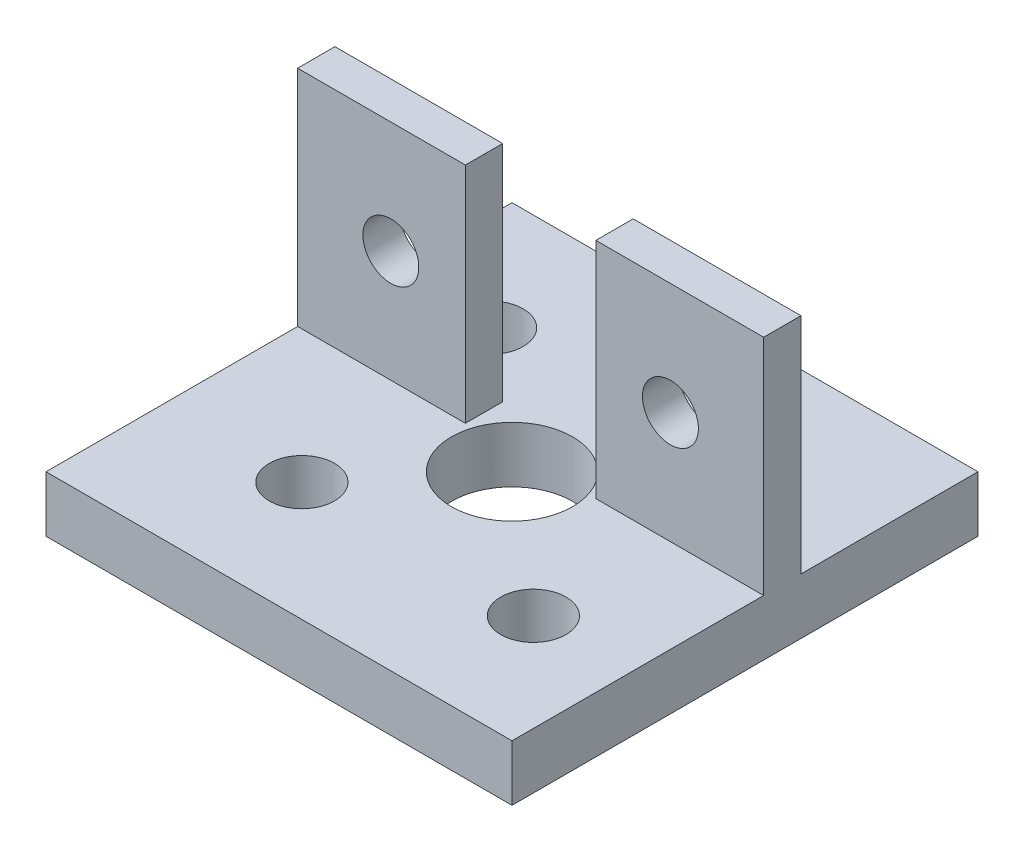
ISO-10303-21;
HEADER;
FILE_DESCRIPTION(('STEP AP214'),'2;1');
FILE_NAME('part.step','',(''),(''),'','','');
FILE_SCHEMA(('AUTOMOTIVE_DESIGN { 1 0 10303 214 1 1 1 1 }'));
ENDSEC;
DATA;
#1=APPLICATION_CONTEXT('core data for automotive mechanical design processes');
#2=APPLICATION_PROTOCOL_DEFINITION('international standard','automotive_design',2000,#1);
#3=PRODUCT_CONTEXT('',#1,'mechanical');
#4=PRODUCT('Part','Part','',(#3));
#5=PRODUCT_RELATED_PRODUCT_CATEGORY('part','',(#4));
#6=PRODUCT_DEFINITION_FORMATION('','',#4);
#7=PRODUCT_DEFINITION_CONTEXT('part definition',#1,'design');
#8=PRODUCT_DEFINITION('design','',#6,#7);
#9=PRODUCT_DEFINITION_SHAPE('','',#8);
#10=(LENGTH_UNIT() NAMED_UNIT(*) SI_UNIT(.MILLI.,.METRE.));
#11=(NAMED_UNIT(*) PLANE_ANGLE_UNIT() SI_UNIT($,.RADIAN.));
#12=(NAMED_UNIT(*) SI_UNIT($,.STERADIAN.) SOLID_ANGLE_UNIT());
#13=UNCERTAINTY_MEASURE_WITH_UNIT(LENGTH_MEASURE(1.E-05),#10,'distance_accuracy_value','');
#14=(GEOMETRIC_REPRESENTATION_CONTEXT(3) GLOBAL_UNCERTAINTY_ASSIGNED_CONTEXT((#13)) GLOBAL_UNIT_ASSIGNED_CONTEXT((#10,
#11,#12)) REPRESENTATION_CONTEXT('',''));
#15=CARTESIAN_POINT('',(0.,0.,0.));
#16=DIRECTION('',(0.,0.,1.));
#17=DIRECTION('',(1.,0.,0.));
#18=AXIS2_PLACEMENT_3D('',#15,#16,#17);
#19=CARTESIAN_POINT('',(0.,3.,0.));
#20=DIRECTION('',(0.,1.,0.));
#21=DIRECTION('',(0.,0.,1.));
#22=AXIS2_PLACEMENT_3D('',#19,#20,#21);
#23=PLANE('',#22);
#24=CARTESIAN_POINT('',(0.,3.,0.));
#25=DIRECTION('',(0.,1.,0.));
#26=DIRECTION('',(0.,0.,1.));
#27=AXIS2_PLACEMENT_3D('',#24,#25,#26);
#28=CIRCLE('',#27,3.25);
#29=CARTESIAN_POINT('',(0.,3.,3.25));
#30=VERTEX_POINT('',#29);
#31=EDGE_CURVE('E257',#30,#30,#28,.T.);
#32=ORIENTED_EDGE('',*,*,#31,.F.);
#33=EDGE_LOOP('',(#32));
#34=FACE_BOUND('',#33,.T.);
#35=CARTESIAN_POINT('',(5.15308596626224,3.,-6.11928958493641));
#36=DIRECTION('',(0.,1.,0.));
#37=DIRECTION('',(0.,0.,1.));
#38=AXIS2_PLACEMENT_3D('',#35,#36,#37);
#39=CIRCLE('',#38,1.75);
#40=CARTESIAN_POINT('',(5.15308596626224,3.,-4.36928958493641));
#41=VERTEX_POINT('',#40);
#42=EDGE_CURVE('E188',#41,#41,#39,.T.);
#43=ORIENTED_EDGE('',*,*,#42,.F.);
#44=EDGE_LOOP('',(#43));
#45=FACE_BOUND('',#44,.T.);
#46=CARTESIAN_POINT('',(-5.15308596626224,3.,6.11928958493641));
#47=DIRECTION('',(0.,1.,0.));
#48=DIRECTION('',(0.,0.,-1.));
#49=AXIS2_PLACEMENT_3D('',#46,#47,#48);
#50=CIRCLE('',#49,1.75);
#51=CARTESIAN_POINT('',(-5.15308596626224,3.,4.36928958493641));
#52=VERTEX_POINT('',#51);
#53=EDGE_CURVE('E195',#52,#52,#50,.T.);
#54=ORIENTED_EDGE('',*,*,#53,.F.);
#55=EDGE_LOOP('',(#54));
#56=FACE_BOUND('',#55,.T.);
#57=CARTESIAN_POINT('',(7.26665638211199,3.,6.11928958493641));
#58=DIRECTION('',(0.,1.,0.));
#59=DIRECTION('',(0.,0.,-1.));
#60=AXIS2_PLACEMENT_3D('',#57,#58,#59);
#61=CIRCLE('',#60,1.75);
#62=CARTESIAN_POINT('',(7.26665638211199,3.,4.3692895849364));
#63=VERTEX_POINT('',#62);
#64=EDGE_CURVE('E182',#63,#63,#61,.T.);
#65=ORIENTED_EDGE('',*,*,#64,.F.);
#66=EDGE_LOOP('',(#65));
#67=FACE_BOUND('',#66,.T.);
#68=CARTESIAN_POINT('',(-7.26665638211198,3.,-6.11928958493641));
#69=DIRECTION('',(0.,1.,0.));
#70=DIRECTION('',(0.,0.,1.));
#71=AXIS2_PLACEMENT_3D('',#68,#69,#70);
#72=CIRCLE('',#71,1.75);
#73=CARTESIAN_POINT('',(-7.26665638211198,3.,-4.36928958493641));
#74=VERTEX_POINT('',#73);
#75=EDGE_CURVE('E200',#74,#74,#72,.T.);
#76=ORIENTED_EDGE('',*,*,#75,.F.);
#77=EDGE_LOOP('',(#76));
#78=FACE_BOUND('',#77,.T.);
#79=DIRECTION('',(0.,0.,-1.));
#80=VECTOR('',#79,1.);
#81=CARTESIAN_POINT('',(12.5,3.,-12.5));
#82=LINE('',#81,#80);
#83=CARTESIAN_POINT('',(12.5,3.,12.5));
#84=VERTEX_POINT('',#83);
#85=CARTESIAN_POINT('',(12.5,3.,-0.999999999999999));
#86=VERTEX_POINT('',#85);
#87=EDGE_CURVE('E206',#84,#86,#82,.T.);
#88=ORIENTED_EDGE('',*,*,#87,.T.);
#89=DIRECTION('',(1.,0.,0.));
#90=VECTOR('',#89,1.);
#91=CARTESIAN_POINT('',(0.,3.,-1.));
#92=LINE('',#91,#90);
#93=CARTESIAN_POINT('',(3.5,3.,-1.));
#94=VERTEX_POINT('',#93);
#95=EDGE_CURVE('E53',#94,#86,#92,.T.);
#96=ORIENTED_EDGE('',*,*,#95,.F.);
#97=DIRECTION('',(0.,0.,1.));
#98=VECTOR('',#97,1.);
#99=CARTESIAN_POINT('',(3.5,3.,0.));
#100=LINE('',#99,#98);
#101=CARTESIAN_POINT('',(3.5,3.,-3.));
#102=VERTEX_POINT('',#101);
#103=EDGE_CURVE('E124',#102,#94,#100,.T.);
#104=ORIENTED_EDGE('',*,*,#103,.F.);
#105=DIRECTION('',(1.,0.,0.));
#106=VECTOR('',#105,1.);
#107=CARTESIAN_POINT('',(0.,3.,-3.));
#108=LINE('',#107,#106);
#109=CARTESIAN_POINT('',(12.5,3.,-3.));
#110=VERTEX_POINT('',#109);
#111=EDGE_CURVE('E59',#102,#110,#108,.T.);
#112=ORIENTED_EDGE('',*,*,#111,.T.);
#113=CARTESIAN_POINT('',(12.5,3.,-12.5));
#114=VERTEX_POINT('',#113);
#115=EDGE_CURVE('E209',#110,#114,#82,.T.);
#116=ORIENTED_EDGE('',*,*,#115,.T.);
#117=DIRECTION('',(-1.,0.,0.));
#118=VECTOR('',#117,1.);
#119=CARTESIAN_POINT('',(-12.5,3.,-12.5));
#120=LINE('',#119,#118);
#121=CARTESIAN_POINT('',(-12.5,3.,-12.5));
#122=VERTEX_POINT('',#121);
#123=EDGE_CURVE('E208',#114,#122,#120,.T.);
#124=ORIENTED_EDGE('',*,*,#123,.T.);
#125=DIRECTION('',(0.,0.,1.));
#126=VECTOR('',#125,1.);
#127=CARTESIAN_POINT('',(-12.5,3.,-12.5));
#128=LINE('',#127,#126);
#129=CARTESIAN_POINT('',(-12.5,3.,-3.));
#130=VERTEX_POINT('',#129);
#131=EDGE_CURVE('E212',#122,#130,#128,.T.);
#132=ORIENTED_EDGE('',*,*,#131,.T.);
#133=DIRECTION('',(1.,0.,0.));
#134=VECTOR('',#133,1.);
#135=CARTESIAN_POINT('',(0.,3.,-3.));
#136=LINE('',#135,#134);
#137=CARTESIAN_POINT('',(-3.5,3.,-3.));
#138=VERTEX_POINT('',#137);
#139=EDGE_CURVE('E168',#130,#138,#136,.T.);
#140=ORIENTED_EDGE('',*,*,#139,.T.);
#141=DIRECTION('',(0.,0.,1.));
#142=VECTOR('',#141,1.);
#143=CARTESIAN_POINT('',(-3.5,3.,0.));
#144=LINE('',#143,#142);
#145=CARTESIAN_POINT('',(-3.5,3.,-1.));
#146=VERTEX_POINT('',#145);
#147=EDGE_CURVE('E128',#138,#146,#144,.T.);
#148=ORIENTED_EDGE('',*,*,#147,.T.);
#149=DIRECTION('',(1.,0.,0.));
#150=VECTOR('',#149,1.);
#151=CARTESIAN_POINT('',(0.,3.,-1.));
#152=LINE('',#151,#150);
#153=CARTESIAN_POINT('',(-12.5,3.,-1.));
#154=VERTEX_POINT('',#153);
#155=EDGE_CURVE('E158',#154,#146,#152,.T.);
#156=ORIENTED_EDGE('',*,*,#155,.F.);
#157=CARTESIAN_POINT('',(-12.5,3.,12.5));
#158=VERTEX_POINT('',#157);
#159=EDGE_CURVE('E211',#154,#158,#128,.T.);
#160=ORIENTED_EDGE('',*,*,#159,.T.);
#161=DIRECTION('',(1.,0.,0.));
#162=VECTOR('',#161,1.);
#163=CARTESIAN_POINT('',(-12.5,3.,12.5));
#164=LINE('',#163,#162);
#165=EDGE_CURVE('E215',#158,#84,#164,.T.);
#166=ORIENTED_EDGE('',*,*,#165,.T.);
#167=EDGE_LOOP('',(#88,#96,#104,#112,#116,#124,#132,#140,#148,#156,#160,#166));
#168=FACE_BOUND('',#167,.T.);
#169=ADVANCED_FACE('F38',(#34,#45,#56,#67,#78,#168),#23,.T.);
#170=CARTESIAN_POINT('',(12.5,3.,-12.5));
#171=DIRECTION('',(-1.,0.,0.));
#172=DIRECTION('',(0.,0.,1.));
#173=AXIS2_PLACEMENT_3D('',#170,#171,#172);
#174=PLANE('',#173);
#175=DIRECTION('',(0.,0.,-1.));
#176=VECTOR('',#175,1.);
#177=CARTESIAN_POINT('',(12.5,0.,-12.5));
#178=LINE('',#177,#176);
#179=CARTESIAN_POINT('',(12.5,0.,12.5));
#180=VERTEX_POINT('',#179);
#181=CARTESIAN_POINT('',(12.5,0.,-12.5));
#182=VERTEX_POINT('',#181);
#183=EDGE_CURVE('E203',#180,#182,#178,.T.);
#184=ORIENTED_EDGE('',*,*,#183,.T.);
#185=DIRECTION('',(0.,-1.,0.));
#186=VECTOR('',#185,1.);
#187=CARTESIAN_POINT('',(12.5,3.,-12.5));
#188=LINE('',#187,#186);
#189=EDGE_CURVE('E11',#114,#182,#188,.T.);
#190=ORIENTED_EDGE('',*,*,#189,.F.);
#191=ORIENTED_EDGE('',*,*,#115,.F.);
#192=DIRECTION('',(0.,-1.,0.));
#193=VECTOR('',#192,1.);
#194=CARTESIAN_POINT('',(12.5,15.,-3.));
#195=LINE('',#194,#193);
#196=CARTESIAN_POINT('',(12.5,15.,-3.));
#197=VERTEX_POINT('',#196);
#198=EDGE_CURVE('E139',#197,#110,#195,.T.);
#199=ORIENTED_EDGE('',*,*,#198,.F.);
#200=DIRECTION('',(0.,0.,-1.));
#201=VECTOR('',#200,1.);
#202=CARTESIAN_POINT('',(12.5,15.,0.));
#203=LINE('',#202,#201);
#204=CARTESIAN_POINT('',(12.5,15.,-1.));
#205=VERTEX_POINT('',#204);
#206=EDGE_CURVE('E151',#205,#197,#203,.T.);
#207=ORIENTED_EDGE('',*,*,#206,.F.);
#208=DIRECTION('',(0.,-1.,0.));
#209=VECTOR('',#208,1.);
#210=CARTESIAN_POINT('',(12.5,15.,-1.));
#211=LINE('',#210,#209);
#212=EDGE_CURVE('E253',#205,#86,#211,.T.);
#213=ORIENTED_EDGE('',*,*,#212,.T.);
#214=ORIENTED_EDGE('',*,*,#87,.F.);
#215=DIRECTION('',(0.,-1.,0.));
#216=VECTOR('',#215,1.);
#217=CARTESIAN_POINT('',(12.5,3.,12.5));
#218=LINE('',#217,#216);
#219=EDGE_CURVE('E217',#84,#180,#218,.T.);
#220=ORIENTED_EDGE('',*,*,#219,.T.);
#221=EDGE_LOOP('',(#184,#190,#191,#199,#207,#213,#214,#220));
#222=FACE_BOUND('',#221,.T.);
#223=ADVANCED_FACE('F40',(#222),#174,.F.);
#224=CARTESIAN_POINT('',(-12.5,3.,-12.5));
#225=DIRECTION('',(0.,0.,1.));
#226=DIRECTION('',(1.,0.,0.));
#227=AXIS2_PLACEMENT_3D('',#224,#225,#226);
#228=PLANE('',#227);
#229=DIRECTION('',(-1.,0.,0.));
#230=VECTOR('',#229,1.);
#231=CARTESIAN_POINT('',(-12.5,0.,-12.5));
#232=LINE('',#231,#230);
#233=CARTESIAN_POINT('',(-12.5,0.,-12.5));
#234=VERTEX_POINT('',#233);
#235=EDGE_CURVE('E220',#182,#234,#232,.T.);
#236=ORIENTED_EDGE('',*,*,#235,.T.);
#237=DIRECTION('',(0.,-1.,0.));
#238=VECTOR('',#237,1.);
#239=CARTESIAN_POINT('',(-12.5,3.,-12.5));
#240=LINE('',#239,#238);
#241=EDGE_CURVE('E46',#122,#234,#240,.T.);
#242=ORIENTED_EDGE('',*,*,#241,.F.);
#243=ORIENTED_EDGE('',*,*,#123,.F.);
#244=ORIENTED_EDGE('',*,*,#189,.T.);
#245=EDGE_LOOP('',(#236,#242,#243,#244));
#246=FACE_BOUND('',#245,.T.);
#247=ADVANCED_FACE('F299',(#246),#228,.F.);
#248=CARTESIAN_POINT('',(-12.5,3.,-12.5));
#249=DIRECTION('',(1.,0.,0.));
#250=DIRECTION('',(0.,0.,-1.));
#251=AXIS2_PLACEMENT_3D('',#248,#249,#250);
#252=PLANE('',#251);
#253=DIRECTION('',(0.,0.,1.));
#254=VECTOR('',#253,1.);
#255=CARTESIAN_POINT('',(-12.5,0.,-12.5));
#256=LINE('',#255,#254);
#257=CARTESIAN_POINT('',(-12.5,0.,12.5));
#258=VERTEX_POINT('',#257);
#259=EDGE_CURVE('E222',#234,#258,#256,.T.);
#260=ORIENTED_EDGE('',*,*,#259,.T.);
#261=DIRECTION('',(0.,-1.,0.));
#262=VECTOR('',#261,1.);
#263=CARTESIAN_POINT('',(-12.5,3.,12.5));
#264=LINE('',#263,#262);
#265=EDGE_CURVE('E228',#158,#258,#264,.T.);
#266=ORIENTED_EDGE('',*,*,#265,.F.);
#267=ORIENTED_EDGE('',*,*,#159,.F.);
#268=DIRECTION('',(0.,-1.,0.));
#269=VECTOR('',#268,1.);
#270=CARTESIAN_POINT('',(-12.5,15.,-1.));
#271=LINE('',#270,#269);
#272=CARTESIAN_POINT('',(-12.5,15.,-1.));
#273=VERTEX_POINT('',#272);
#274=EDGE_CURVE('E174',#273,#154,#271,.T.);
#275=ORIENTED_EDGE('',*,*,#274,.F.);
#276=DIRECTION('',(0.,0.,1.));
#277=VECTOR('',#276,1.);
#278=CARTESIAN_POINT('',(-12.5,15.,0.));
#279=LINE('',#278,#277);
#280=CARTESIAN_POINT('',(-12.5,15.,-3.));
#281=VERTEX_POINT('',#280);
#282=EDGE_CURVE('E161',#281,#273,#279,.T.);
#283=ORIENTED_EDGE('',*,*,#282,.F.);
#284=DIRECTION('',(0.,-1.,0.));
#285=VECTOR('',#284,1.);
#286=CARTESIAN_POINT('',(-12.5,15.,-3.));
#287=LINE('',#286,#285);
#288=EDGE_CURVE('E176',#281,#130,#287,.T.);
#289=ORIENTED_EDGE('',*,*,#288,.T.);
#290=ORIENTED_EDGE('',*,*,#131,.F.);
#291=ORIENTED_EDGE('',*,*,#241,.T.);
#292=EDGE_LOOP('',(#260,#266,#267,#275,#283,#289,#290,#291));
#293=FACE_BOUND('',#292,.T.);
#294=ADVANCED_FACE('F235',(#293),#252,.F.);
#295=CARTESIAN_POINT('',(-12.5,3.,12.5));
#296=DIRECTION('',(0.,0.,-1.));
#297=DIRECTION('',(-1.,0.,0.));
#298=AXIS2_PLACEMENT_3D('',#295,#296,#297);
#299=PLANE('',#298);
#300=DIRECTION('',(1.,0.,0.));
#301=VECTOR('',#300,1.);
#302=CARTESIAN_POINT('',(-12.5,0.,12.5));
#303=LINE('',#302,#301);
#304=EDGE_CURVE('E224',#258,#180,#303,.T.);
#305=ORIENTED_EDGE('',*,*,#304,.T.);
#306=ORIENTED_EDGE('',*,*,#219,.F.);
#307=ORIENTED_EDGE('',*,*,#165,.F.);
#308=ORIENTED_EDGE('',*,*,#265,.T.);
#309=EDGE_LOOP('',(#305,#306,#307,#308));
#310=FACE_BOUND('',#309,.T.);
#311=ADVANCED_FACE('F245',(#310),#299,.F.);
#312=CARTESIAN_POINT('',(0.,0.,0.));
#313=DIRECTION('',(0.,1.,0.));
#314=DIRECTION('',(0.,0.,1.));
#315=AXIS2_PLACEMENT_3D('',#312,#313,#314);
#316=PLANE('',#315);
#317=CARTESIAN_POINT('',(0.,0.,0.));
#318=DIRECTION('',(0.,-1.,0.));
#319=DIRECTION('',(0.,0.,-1.));
#320=AXIS2_PLACEMENT_3D('',#317,#318,#319);
#321=CIRCLE('',#320,3.25);
#322=CARTESIAN_POINT('',(0.,0.,-3.25));
#323=VERTEX_POINT('',#322);
#324=EDGE_CURVE('E261',#323,#323,#321,.T.);
#325=ORIENTED_EDGE('',*,*,#324,.F.);
#326=EDGE_LOOP('',(#325));
#327=FACE_BOUND('',#326,.T.);
#328=CARTESIAN_POINT('',(5.15308596626224,0.,-6.11928958493641));
#329=DIRECTION('',(0.,1.,0.));
#330=DIRECTION('',(0.,0.,1.));
#331=AXIS2_PLACEMENT_3D('',#328,#329,#330);
#332=CIRCLE('',#331,1.75);
#333=CARTESIAN_POINT('',(5.15308596626224,0.,-4.36928958493641));
#334=VERTEX_POINT('',#333);
#335=EDGE_CURVE('E192',#334,#334,#332,.T.);
#336=ORIENTED_EDGE('',*,*,#335,.T.);
#337=EDGE_LOOP('',(#336));
#338=FACE_BOUND('',#337,.T.);
#339=CARTESIAN_POINT('',(-5.15308596626224,0.,6.11928958493641));
#340=DIRECTION('',(0.,1.,0.));
#341=DIRECTION('',(0.,0.,-1.));
#342=AXIS2_PLACEMENT_3D('',#339,#340,#341);
#343=CIRCLE('',#342,1.75);
#344=CARTESIAN_POINT('',(-5.15308596626224,0.,4.36928958493641));
#345=VERTEX_POINT('',#344);
#346=EDGE_CURVE('E185',#345,#345,#343,.T.);
#347=ORIENTED_EDGE('',*,*,#346,.T.);
#348=EDGE_LOOP('',(#347));
#349=FACE_BOUND('',#348,.T.);
#350=CARTESIAN_POINT('',(7.26665638211199,0.,6.11928958493641));
#351=DIRECTION('',(0.,1.,0.));
#352=DIRECTION('',(0.,0.,-1.));
#353=AXIS2_PLACEMENT_3D('',#350,#351,#352);
#354=CIRCLE('',#353,1.75);
#355=CARTESIAN_POINT('',(7.26665638211199,0.,4.3692895849364));
#356=VERTEX_POINT('',#355);
#357=EDGE_CURVE('E181',#356,#356,#354,.T.);
#358=ORIENTED_EDGE('',*,*,#357,.T.);
#359=EDGE_LOOP('',(#358));
#360=FACE_BOUND('',#359,.T.);
#361=CARTESIAN_POINT('',(-7.26665638211198,0.,-6.11928958493641));
#362=DIRECTION('',(0.,1.,0.));
#363=DIRECTION('',(0.,0.,1.));
#364=AXIS2_PLACEMENT_3D('',#361,#362,#363);
#365=CIRCLE('',#364,1.75);
#366=CARTESIAN_POINT('',(-7.26665638211198,0.,-4.36928958493641));
#367=VERTEX_POINT('',#366);
#368=EDGE_CURVE('E191',#367,#367,#365,.T.);
#369=ORIENTED_EDGE('',*,*,#368,.T.);
#370=EDGE_LOOP('',(#369));
#371=FACE_BOUND('',#370,.T.);
#372=ORIENTED_EDGE('',*,*,#183,.F.);
#373=ORIENTED_EDGE('',*,*,#304,.F.);
#374=ORIENTED_EDGE('',*,*,#259,.F.);
#375=ORIENTED_EDGE('',*,*,#235,.F.);
#376=EDGE_LOOP('',(#372,#373,#374,#375));
#377=FACE_BOUND('',#376,.T.);
#378=ADVANCED_FACE('F242',(#327,#338,#349,#360,#371,#377),#316,.F.);
#379=CARTESIAN_POINT('',(-7.26665638211198,3.,-6.11928958493641));
#380=DIRECTION('',(0.,-1.,0.));
#381=DIRECTION('',(0.,0.,-1.));
#382=AXIS2_PLACEMENT_3D('',#379,#380,#381);
#383=CYLINDRICAL_SURFACE('',#382,1.75);
#384=ORIENTED_EDGE('',*,*,#75,.T.);
#385=EDGE_LOOP('',(#384));
#386=FACE_BOUND('',#385,.T.);
#387=ORIENTED_EDGE('',*,*,#368,.F.);
#388=EDGE_LOOP('',(#387));
#389=FACE_BOUND('',#388,.T.);
#390=ADVANCED_FACE('F304',(#386,#389),#383,.F.);
#391=CARTESIAN_POINT('',(7.26665638211199,3.,6.11928958493641));
#392=DIRECTION('',(0.,-1.,0.));
#393=DIRECTION('',(0.,0.,-1.));
#394=AXIS2_PLACEMENT_3D('',#391,#392,#393);
#395=CYLINDRICAL_SURFACE('',#394,1.75);
#396=ORIENTED_EDGE('',*,*,#64,.T.);
#397=EDGE_LOOP('',(#396));
#398=FACE_BOUND('',#397,.T.);
#399=ORIENTED_EDGE('',*,*,#357,.F.);
#400=EDGE_LOOP('',(#399));
#401=FACE_BOUND('',#400,.T.);
#402=ADVANCED_FACE('F346',(#398,#401),#395,.F.);
#403=CARTESIAN_POINT('',(-5.15308596626224,3.,6.11928958493641));
#404=DIRECTION('',(0.,-1.,0.));
#405=DIRECTION('',(0.,0.,-1.));
#406=AXIS2_PLACEMENT_3D('',#403,#404,#405);
#407=CYLINDRICAL_SURFACE('',#406,1.75);
#408=ORIENTED_EDGE('',*,*,#53,.T.);
#409=EDGE_LOOP('',(#408));
#410=FACE_BOUND('',#409,.T.);
#411=ORIENTED_EDGE('',*,*,#346,.F.);
#412=EDGE_LOOP('',(#411));
#413=FACE_BOUND('',#412,.T.);
#414=ADVANCED_FACE('F349',(#410,#413),#407,.F.);
#415=CARTESIAN_POINT('',(5.15308596626224,3.,-6.11928958493641));
#416=DIRECTION('',(0.,-1.,0.));
#417=DIRECTION('',(0.,0.,-1.));
#418=AXIS2_PLACEMENT_3D('',#415,#416,#417);
#419=CYLINDRICAL_SURFACE('',#418,1.75);
#420=ORIENTED_EDGE('',*,*,#42,.T.);
#421=EDGE_LOOP('',(#420));
#422=FACE_BOUND('',#421,.T.);
#423=ORIENTED_EDGE('',*,*,#335,.F.);
#424=EDGE_LOOP('',(#423));
#425=FACE_BOUND('',#424,.T.);
#426=ADVANCED_FACE('F345',(#422,#425),#419,.F.);
#427=CARTESIAN_POINT('',(-3.5,15.,0.));
#428=DIRECTION('',(1.,0.,0.));
#429=DIRECTION('',(0.,0.,-1.));
#430=AXIS2_PLACEMENT_3D('',#427,#428,#429);
#431=PLANE('',#430);
#432=ORIENTED_EDGE('',*,*,#147,.F.);
#433=DIRECTION('',(0.,-1.,0.));
#434=VECTOR('',#433,1.);
#435=CARTESIAN_POINT('',(-3.5,15.,-3.));
#436=LINE('',#435,#434);
#437=CARTESIAN_POINT('',(-3.5,15.,-3.));
#438=VERTEX_POINT('',#437);
#439=EDGE_CURVE('E178',#438,#138,#436,.T.);
#440=ORIENTED_EDGE('',*,*,#439,.F.);
#441=DIRECTION('',(0.,0.,1.));
#442=VECTOR('',#441,1.);
#443=CARTESIAN_POINT('',(-3.5,15.,0.));
#444=LINE('',#443,#442);
#445=CARTESIAN_POINT('',(-3.5,15.,-1.));
#446=VERTEX_POINT('',#445);
#447=EDGE_CURVE('E154',#438,#446,#444,.T.);
#448=ORIENTED_EDGE('',*,*,#447,.T.);
#449=DIRECTION('',(0.,-1.,0.));
#450=VECTOR('',#449,1.);
#451=CARTESIAN_POINT('',(-3.5,15.,-1.));
#452=LINE('',#451,#450);
#453=EDGE_CURVE('E165',#446,#146,#452,.T.);
#454=ORIENTED_EDGE('',*,*,#453,.T.);
#455=EDGE_LOOP('',(#432,#440,#448,#454));
#456=FACE_BOUND('',#455,.T.);
#457=ADVANCED_FACE('F323',(#456),#431,.T.);
#458=CARTESIAN_POINT('',(0.,15.,-3.));
#459=DIRECTION('',(0.,0.,-1.));
#460=DIRECTION('',(-1.,0.,0.));
#461=AXIS2_PLACEMENT_3D('',#458,#459,#460);
#462=PLANE('',#461);
#463=CARTESIAN_POINT('',(-7.5,9.,-3.));
#464=DIRECTION('',(0.,0.,1.));
#465=DIRECTION('',(1.,0.,0.));
#466=AXIS2_PLACEMENT_3D('',#463,#464,#465);
#467=CIRCLE('',#466,1.5);
#468=CARTESIAN_POINT('',(-6.,9.,-3.));
#469=VERTEX_POINT('',#468);
#470=EDGE_CURVE('E267',#469,#469,#467,.T.);
#471=ORIENTED_EDGE('',*,*,#470,.T.);
#472=EDGE_LOOP('',(#471));
#473=FACE_BOUND('',#472,.T.);
#474=ORIENTED_EDGE('',*,*,#139,.F.);
#475=ORIENTED_EDGE('',*,*,#288,.F.);
#476=DIRECTION('',(1.,0.,0.));
#477=VECTOR('',#476,1.);
#478=CARTESIAN_POINT('',(0.,15.,-3.));
#479=LINE('',#478,#477);
#480=EDGE_CURVE('E157',#281,#438,#479,.T.);
#481=ORIENTED_EDGE('',*,*,#480,.T.);
#482=ORIENTED_EDGE('',*,*,#439,.T.);
#483=EDGE_LOOP('',(#474,#475,#481,#482));
#484=FACE_BOUND('',#483,.T.);
#485=ADVANCED_FACE('F318',(#473,#484),#462,.T.);
#486=CARTESIAN_POINT('',(0.,15.,-1.));
#487=DIRECTION('',(0.,0.,-1.));
#488=DIRECTION('',(-1.,0.,0.));
#489=AXIS2_PLACEMENT_3D('',#486,#487,#488);
#490=PLANE('',#489);
#491=CARTESIAN_POINT('',(-7.5,9.,-1.));
#492=DIRECTION('',(0.,0.,-1.));
#493=DIRECTION('',(-1.,0.,0.));
#494=AXIS2_PLACEMENT_3D('',#491,#492,#493);
#495=CIRCLE('',#494,1.5);
#496=CARTESIAN_POINT('',(-9.,9.,-1.));
#497=VERTEX_POINT('',#496);
#498=EDGE_CURVE('E271',#497,#497,#495,.T.);
#499=ORIENTED_EDGE('',*,*,#498,.T.);
#500=EDGE_LOOP('',(#499));
#501=FACE_BOUND('',#500,.T.);
#502=ORIENTED_EDGE('',*,*,#155,.T.);
#503=ORIENTED_EDGE('',*,*,#453,.F.);
#504=DIRECTION('',(1.,0.,0.));
#505=VECTOR('',#504,1.);
#506=CARTESIAN_POINT('',(0.,15.,-1.));
#507=LINE('',#506,#505);
#508=EDGE_CURVE('E163',#273,#446,#507,.T.);
#509=ORIENTED_EDGE('',*,*,#508,.F.);
#510=ORIENTED_EDGE('',*,*,#274,.T.);
#511=EDGE_LOOP('',(#502,#503,#509,#510));
#512=FACE_BOUND('',#511,.T.);
#513=ADVANCED_FACE('F330',(#501,#512),#490,.F.);
#514=CARTESIAN_POINT('',(0.,15.,0.));
#515=DIRECTION('',(0.,1.,0.));
#516=DIRECTION('',(0.,0.,1.));
#517=AXIS2_PLACEMENT_3D('',#514,#515,#516);
#518=PLANE('',#517);
#519=ORIENTED_EDGE('',*,*,#447,.F.);
#520=ORIENTED_EDGE('',*,*,#480,.F.);
#521=ORIENTED_EDGE('',*,*,#282,.T.);
#522=ORIENTED_EDGE('',*,*,#508,.T.);
#523=EDGE_LOOP('',(#519,#520,#521,#522));
#524=FACE_BOUND('',#523,.T.);
#525=ADVANCED_FACE('F325',(#524),#518,.T.);
#526=CARTESIAN_POINT('',(3.5,15.,0.));
#527=DIRECTION('',(1.,0.,0.));
#528=DIRECTION('',(0.,0.,-1.));
#529=AXIS2_PLACEMENT_3D('',#526,#527,#528);
#530=PLANE('',#529);
#531=ORIENTED_EDGE('',*,*,#103,.T.);
#532=DIRECTION('',(0.,-1.,0.));
#533=VECTOR('',#532,1.);
#534=CARTESIAN_POINT('',(3.5,15.,-1.));
#535=LINE('',#534,#533);
#536=CARTESIAN_POINT('',(3.5,15.,-1.));
#537=VERTEX_POINT('',#536);
#538=EDGE_CURVE('E256',#537,#94,#535,.T.);
#539=ORIENTED_EDGE('',*,*,#538,.F.);
#540=DIRECTION('',(0.,0.,1.));
#541=VECTOR('',#540,1.);
#542=CARTESIAN_POINT('',(3.5,15.,0.));
#543=LINE('',#542,#541);
#544=CARTESIAN_POINT('',(3.5,15.,-3.));
#545=VERTEX_POINT('',#544);
#546=EDGE_CURVE('E134',#545,#537,#543,.T.);
#547=ORIENTED_EDGE('',*,*,#546,.F.);
#548=DIRECTION('',(0.,-1.,0.));
#549=VECTOR('',#548,1.);
#550=CARTESIAN_POINT('',(3.5,15.,-3.));
#551=LINE('',#550,#549);
#552=EDGE_CURVE('E131',#545,#102,#551,.T.);
#553=ORIENTED_EDGE('',*,*,#552,.T.);
#554=EDGE_LOOP('',(#531,#539,#547,#553));
#555=FACE_BOUND('',#554,.T.);
#556=ADVANCED_FACE('F132',(#555),#530,.F.);
#557=CARTESIAN_POINT('',(0.,15.,-1.));
#558=DIRECTION('',(0.,0.,-1.));
#559=DIRECTION('',(-1.,0.,0.));
#560=AXIS2_PLACEMENT_3D('',#557,#558,#559);
#561=PLANE('',#560);
#562=CARTESIAN_POINT('',(7.5,9.,-1.));
#563=DIRECTION('',(0.,0.,-1.));
#564=DIRECTION('',(-1.,0.,0.));
#565=AXIS2_PLACEMENT_3D('',#562,#563,#564);
#566=CIRCLE('',#565,1.5);
#567=CARTESIAN_POINT('',(6.,9.,-1.));
#568=VERTEX_POINT('',#567);
#569=EDGE_CURVE('E266',#568,#568,#566,.F.);
#570=ORIENTED_EDGE('',*,*,#569,.F.);
#571=EDGE_LOOP('',(#570));
#572=FACE_BOUND('',#571,.T.);
#573=ORIENTED_EDGE('',*,*,#95,.T.);
#574=ORIENTED_EDGE('',*,*,#212,.F.);
#575=DIRECTION('',(1.,0.,0.));
#576=VECTOR('',#575,1.);
#577=CARTESIAN_POINT('',(0.,15.,-1.));
#578=LINE('',#577,#576);
#579=EDGE_CURVE('E146',#537,#205,#578,.T.);
#580=ORIENTED_EDGE('',*,*,#579,.F.);
#581=ORIENTED_EDGE('',*,*,#538,.T.);
#582=EDGE_LOOP('',(#573,#574,#580,#581));
#583=FACE_BOUND('',#582,.T.);
#584=ADVANCED_FACE('F255',(#572,#583),#561,.F.);
#585=CARTESIAN_POINT('',(0.,15.,-3.));
#586=DIRECTION('',(0.,0.,-1.));
#587=DIRECTION('',(-1.,0.,0.));
#588=AXIS2_PLACEMENT_3D('',#585,#586,#587);
#589=PLANE('',#588);
#590=CARTESIAN_POINT('',(7.5,9.,-3.));
#591=DIRECTION('',(0.,0.,-1.));
#592=DIRECTION('',(-1.,0.,0.));
#593=AXIS2_PLACEMENT_3D('',#590,#591,#592);
#594=CIRCLE('',#593,1.5);
#595=CARTESIAN_POINT('',(6.,9.,-3.));
#596=VERTEX_POINT('',#595);
#597=EDGE_CURVE('E270',#596,#596,#594,.T.);
#598=ORIENTED_EDGE('',*,*,#597,.F.);
#599=EDGE_LOOP('',(#598));
#600=FACE_BOUND('',#599,.T.);
#601=ORIENTED_EDGE('',*,*,#111,.F.);
#602=ORIENTED_EDGE('',*,*,#552,.F.);
#603=DIRECTION('',(1.,0.,0.));
#604=VECTOR('',#603,1.);
#605=CARTESIAN_POINT('',(0.,15.,-3.));
#606=LINE('',#605,#604);
#607=EDGE_CURVE('E138',#545,#197,#606,.T.);
#608=ORIENTED_EDGE('',*,*,#607,.T.);
#609=ORIENTED_EDGE('',*,*,#198,.T.);
#610=EDGE_LOOP('',(#601,#602,#608,#609));
#611=FACE_BOUND('',#610,.T.);
#612=ADVANCED_FACE('F142',(#600,#611),#589,.T.);
#613=CARTESIAN_POINT('',(0.,15.,0.));
#614=DIRECTION('',(0.,1.,0.));
#615=DIRECTION('',(0.,0.,1.));
#616=AXIS2_PLACEMENT_3D('',#613,#614,#615);
#617=PLANE('',#616);
#618=ORIENTED_EDGE('',*,*,#546,.T.);
#619=ORIENTED_EDGE('',*,*,#579,.T.);
#620=ORIENTED_EDGE('',*,*,#206,.T.);
#621=ORIENTED_EDGE('',*,*,#607,.F.);
#622=EDGE_LOOP('',(#618,#619,#620,#621));
#623=FACE_BOUND('',#622,.T.);
#624=ADVANCED_FACE('F282',(#623),#617,.T.);
#625=CARTESIAN_POINT('',(0.,15.,0.));
#626=DIRECTION('',(0.,-1.,0.));
#627=DIRECTION('',(0.,0.,-1.));
#628=AXIS2_PLACEMENT_3D('',#625,#626,#627);
#629=CYLINDRICAL_SURFACE('',#628,3.25);
#630=ORIENTED_EDGE('',*,*,#31,.T.);
#631=EDGE_LOOP('',(#630));
#632=FACE_BOUND('',#631,.T.);
#633=ORIENTED_EDGE('',*,*,#324,.T.);
#634=EDGE_LOOP('',(#633));
#635=FACE_BOUND('',#634,.T.);
#636=ADVANCED_FACE('F288',(#632,#635),#629,.F.);
#637=CARTESIAN_POINT('',(7.5,9.,3.24264068711929));
#638=DIRECTION('',(0.,0.,-1.));
#639=DIRECTION('',(-1.,0.,0.));
#640=AXIS2_PLACEMENT_3D('',#637,#638,#639);
#641=CYLINDRICAL_SURFACE('',#640,1.5);
#642=ORIENTED_EDGE('',*,*,#569,.T.);
#643=EDGE_LOOP('',(#642));
#644=FACE_BOUND('',#643,.T.);
#645=ORIENTED_EDGE('',*,*,#597,.T.);
#646=EDGE_LOOP('',(#645));
#647=FACE_BOUND('',#646,.T.);
#648=ADVANCED_FACE('F279',(#644,#647),#641,.F.);
#649=CARTESIAN_POINT('',(-7.5,9.,3.24264068711929));
#650=DIRECTION('',(0.,0.,-1.));
#651=DIRECTION('',(-1.,0.,0.));
#652=AXIS2_PLACEMENT_3D('',#649,#650,#651);
#653=CYLINDRICAL_SURFACE('',#652,1.5);
#654=ORIENTED_EDGE('',*,*,#498,.F.);
#655=EDGE_LOOP('',(#654));
#656=FACE_BOUND('',#655,.T.);
#657=ORIENTED_EDGE('',*,*,#470,.F.);
#658=EDGE_LOOP('',(#657));
#659=FACE_BOUND('',#658,.T.);
#660=ADVANCED_FACE('F476',(#656,#659),#653,.F.);
#661=CLOSED_SHELL('',(#169,#223,#247,#294,#311,#378,#390,#402,#414,#426,#457,#485,#513,#525,
#556,#584,#612,#624,#636,#648,#660));
#662=MANIFOLD_SOLID_BREP('B2',#661);
#663=ADVANCED_BREP_SHAPE_REPRESENTATION('',(#18,#662),#14);
#664=SHAPE_DEFINITION_REPRESENTATION(#9,#663);
ENDSEC;
END-ISO-10303-21;
